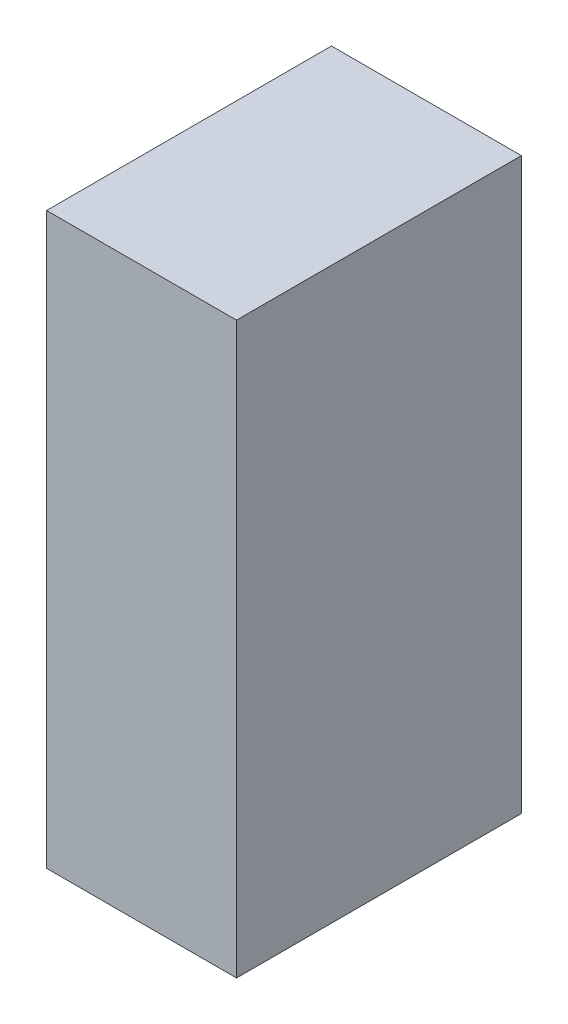
ISO-10303-21;
HEADER;
FILE_DESCRIPTION(('STEP AP214'),'2;1');
FILE_NAME('part.step','',(''),(''),'','','');
FILE_SCHEMA(('AUTOMOTIVE_DESIGN { 1 0 10303 214 1 1 1 1 }'));
ENDSEC;
DATA;
#1=APPLICATION_CONTEXT('core data for automotive mechanical design processes');
#2=APPLICATION_PROTOCOL_DEFINITION('international standard','automotive_design',2000,#1);
#3=PRODUCT_CONTEXT('',#1,'mechanical');
#4=PRODUCT('Part','Part','',(#3));
#5=PRODUCT_RELATED_PRODUCT_CATEGORY('part','',(#4));
#6=PRODUCT_DEFINITION_FORMATION('','',#4);
#7=PRODUCT_DEFINITION_CONTEXT('part definition',#1,'design');
#8=PRODUCT_DEFINITION('design','',#6,#7);
#9=PRODUCT_DEFINITION_SHAPE('','',#8);
#10=(LENGTH_UNIT() NAMED_UNIT(*) SI_UNIT(.MILLI.,.METRE.));
#11=(NAMED_UNIT(*) PLANE_ANGLE_UNIT() SI_UNIT($,.RADIAN.));
#12=(NAMED_UNIT(*) SI_UNIT($,.STERADIAN.) SOLID_ANGLE_UNIT());
#13=UNCERTAINTY_MEASURE_WITH_UNIT(LENGTH_MEASURE(1.E-05),#10,'distance_accuracy_value','');
#14=(GEOMETRIC_REPRESENTATION_CONTEXT(3) GLOBAL_UNCERTAINTY_ASSIGNED_CONTEXT((#13)) GLOBAL_UNIT_ASSIGNED_CONTEXT((#10,
#11,#12)) REPRESENTATION_CONTEXT('',''));
#15=CARTESIAN_POINT('',(0.,0.,0.));
#16=DIRECTION('',(0.,0.,1.));
#17=DIRECTION('',(1.,0.,0.));
#18=AXIS2_PLACEMENT_3D('',#15,#16,#17);
#19=CARTESIAN_POINT('',(2.,12.,3.));
#20=DIRECTION('',(-1.,0.,0.));
#21=DIRECTION('',(0.,0.,1.));
#22=AXIS2_PLACEMENT_3D('',#19,#20,#21);
#23=PLANE('',#22);
#24=DIRECTION('',(0.,0.,-1.));
#25=VECTOR('',#24,1.);
#26=CARTESIAN_POINT('',(2.,0.,3.));
#27=LINE('',#26,#25);
#28=CARTESIAN_POINT('',(2.,0.,3.));
#29=VERTEX_POINT('',#28);
#30=CARTESIAN_POINT('',(2.,0.,-3.));
#31=VERTEX_POINT('',#30);
#32=EDGE_CURVE('E113',#29,#31,#27,.T.);
#33=ORIENTED_EDGE('',*,*,#32,.T.);
#34=DIRECTION('',(0.,-1.,0.));
#35=VECTOR('',#34,1.);
#36=CARTESIAN_POINT('',(2.,12.,-3.));
#37=LINE('',#36,#35);
#38=CARTESIAN_POINT('',(2.,12.,-3.));
#39=VERTEX_POINT('',#38);
#40=EDGE_CURVE('E11',#39,#31,#37,.T.);
#41=ORIENTED_EDGE('',*,*,#40,.F.);
#42=DIRECTION('',(0.,0.,-1.));
#43=VECTOR('',#42,1.);
#44=CARTESIAN_POINT('',(2.,12.,3.));
#45=LINE('',#44,#43);
#46=CARTESIAN_POINT('',(2.,12.,3.));
#47=VERTEX_POINT('',#46);
#48=EDGE_CURVE('E97',#47,#39,#45,.T.);
#49=ORIENTED_EDGE('',*,*,#48,.F.);
#50=DIRECTION('',(0.,-1.,0.));
#51=VECTOR('',#50,1.);
#52=CARTESIAN_POINT('',(2.,12.,3.));
#53=LINE('',#52,#51);
#54=EDGE_CURVE('E109',#47,#29,#53,.T.);
#55=ORIENTED_EDGE('',*,*,#54,.T.);
#56=EDGE_LOOP('',(#33,#41,#49,#55));
#57=FACE_BOUND('',#56,.T.);
#58=ADVANCED_FACE('F45',(#57),#23,.F.);
#59=CARTESIAN_POINT('',(-2.,12.,-3.));
#60=DIRECTION('',(0.,0.,1.));
#61=DIRECTION('',(1.,0.,0.));
#62=AXIS2_PLACEMENT_3D('',#59,#60,#61);
#63=PLANE('',#62);
#64=DIRECTION('',(-1.,0.,0.));
#65=VECTOR('',#64,1.);
#66=CARTESIAN_POINT('',(-2.,0.,-3.));
#67=LINE('',#66,#65);
#68=CARTESIAN_POINT('',(-2.,0.,-3.));
#69=VERTEX_POINT('',#68);
#70=EDGE_CURVE('E102',#31,#69,#67,.T.);
#71=ORIENTED_EDGE('',*,*,#70,.T.);
#72=DIRECTION('',(0.,-1.,0.));
#73=VECTOR('',#72,1.);
#74=CARTESIAN_POINT('',(-2.,12.,-3.));
#75=LINE('',#74,#73);
#76=CARTESIAN_POINT('',(-2.,12.,-3.));
#77=VERTEX_POINT('',#76);
#78=EDGE_CURVE('E54',#77,#69,#75,.T.);
#79=ORIENTED_EDGE('',*,*,#78,.F.);
#80=DIRECTION('',(-1.,0.,0.));
#81=VECTOR('',#80,1.);
#82=CARTESIAN_POINT('',(-2.,12.,-3.));
#83=LINE('',#82,#81);
#84=EDGE_CURVE('E92',#39,#77,#83,.T.);
#85=ORIENTED_EDGE('',*,*,#84,.F.);
#86=ORIENTED_EDGE('',*,*,#40,.T.);
#87=EDGE_LOOP('',(#71,#79,#85,#86));
#88=FACE_BOUND('',#87,.T.);
#89=ADVANCED_FACE('F101',(#88),#63,.F.);
#90=CARTESIAN_POINT('',(-2.,12.,3.));
#91=DIRECTION('',(1.,0.,0.));
#92=DIRECTION('',(0.,0.,-1.));
#93=AXIS2_PLACEMENT_3D('',#90,#91,#92);
#94=PLANE('',#93);
#95=DIRECTION('',(0.,0.,1.));
#96=VECTOR('',#95,1.);
#97=CARTESIAN_POINT('',(-2.,0.,3.));
#98=LINE('',#97,#96);
#99=CARTESIAN_POINT('',(-2.,0.,3.));
#100=VERTEX_POINT('',#99);
#101=EDGE_CURVE('E79',#69,#100,#98,.T.);
#102=ORIENTED_EDGE('',*,*,#101,.T.);
#103=DIRECTION('',(0.,-1.,0.));
#104=VECTOR('',#103,1.);
#105=CARTESIAN_POINT('',(-2.,12.,3.));
#106=LINE('',#105,#104);
#107=CARTESIAN_POINT('',(-2.,12.,3.));
#108=VERTEX_POINT('',#107);
#109=EDGE_CURVE('E104',#108,#100,#106,.T.);
#110=ORIENTED_EDGE('',*,*,#109,.F.);
#111=DIRECTION('',(0.,0.,1.));
#112=VECTOR('',#111,1.);
#113=CARTESIAN_POINT('',(-2.,12.,3.));
#114=LINE('',#113,#112);
#115=EDGE_CURVE('E95',#77,#108,#114,.T.);
#116=ORIENTED_EDGE('',*,*,#115,.F.);
#117=ORIENTED_EDGE('',*,*,#78,.T.);
#118=EDGE_LOOP('',(#102,#110,#116,#117));
#119=FACE_BOUND('',#118,.T.);
#120=ADVANCED_FACE('F105',(#119),#94,.F.);
#121=CARTESIAN_POINT('',(-2.,12.,3.));
#122=DIRECTION('',(0.,0.,-1.));
#123=DIRECTION('',(-1.,0.,0.));
#124=AXIS2_PLACEMENT_3D('',#121,#122,#123);
#125=PLANE('',#124);
#126=DIRECTION('',(1.,0.,0.));
#127=VECTOR('',#126,1.);
#128=CARTESIAN_POINT('',(-2.,0.,3.));
#129=LINE('',#128,#127);
#130=EDGE_CURVE('E85',#100,#29,#129,.T.);
#131=ORIENTED_EDGE('',*,*,#130,.T.);
#132=ORIENTED_EDGE('',*,*,#54,.F.);
#133=DIRECTION('',(1.,0.,0.));
#134=VECTOR('',#133,1.);
#135=CARTESIAN_POINT('',(-2.,12.,3.));
#136=LINE('',#135,#134);
#137=EDGE_CURVE('E62',#108,#47,#136,.T.);
#138=ORIENTED_EDGE('',*,*,#137,.F.);
#139=ORIENTED_EDGE('',*,*,#109,.T.);
#140=EDGE_LOOP('',(#131,#132,#138,#139));
#141=FACE_BOUND('',#140,.T.);
#142=ADVANCED_FACE('F126',(#141),#125,.F.);
#143=CARTESIAN_POINT('',(0.,12.,0.));
#144=DIRECTION('',(0.,-1.,0.));
#145=DIRECTION('',(0.,0.,-1.));
#146=AXIS2_PLACEMENT_3D('',#143,#144,#145);
#147=PLANE('',#146);
#148=ORIENTED_EDGE('',*,*,#48,.T.);
#149=ORIENTED_EDGE('',*,*,#84,.T.);
#150=ORIENTED_EDGE('',*,*,#115,.T.);
#151=ORIENTED_EDGE('',*,*,#137,.T.);
#152=EDGE_LOOP('',(#148,#149,#150,#151));
#153=FACE_BOUND('',#152,.T.);
#154=ADVANCED_FACE('F93',(#153),#147,.F.);
#155=CARTESIAN_POINT('',(0.,0.,0.));
#156=DIRECTION('',(0.,-1.,0.));
#157=DIRECTION('',(0.,0.,-1.));
#158=AXIS2_PLACEMENT_3D('',#155,#156,#157);
#159=PLANE('',#158);
#160=ORIENTED_EDGE('',*,*,#32,.F.);
#161=ORIENTED_EDGE('',*,*,#130,.F.);
#162=ORIENTED_EDGE('',*,*,#101,.F.);
#163=ORIENTED_EDGE('',*,*,#70,.F.);
#164=EDGE_LOOP('',(#160,#161,#162,#163));
#165=FACE_BOUND('',#164,.T.);
#166=ADVANCED_FACE('F129',(#165),#159,.T.);
#167=CLOSED_SHELL('',(#58,#89,#120,#142,#154,#166));
#168=MANIFOLD_SOLID_BREP('B2',#167);
#169=ADVANCED_BREP_SHAPE_REPRESENTATION('',(#18,#168),#14);
#170=SHAPE_DEFINITION_REPRESENTATION(#9,#169);
ENDSEC;
END-ISO-10303-21;
